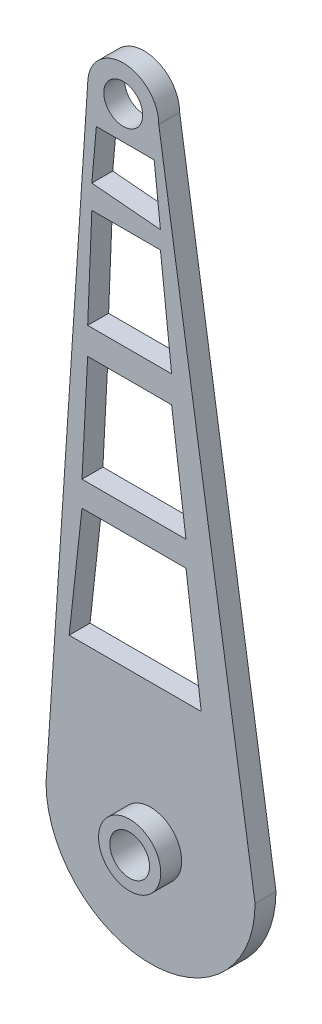
ISO-10303-21;
HEADER;
FILE_DESCRIPTION(('STEP AP214'),'2;1');
FILE_NAME('part.step','',(''),(''),'','','');
FILE_SCHEMA(('AUTOMOTIVE_DESIGN { 1 0 10303 214 1 1 1 1 }'));
ENDSEC;
DATA;
#1=APPLICATION_CONTEXT('core data for automotive mechanical design processes');
#2=APPLICATION_PROTOCOL_DEFINITION('international standard','automotive_design',2000,#1);
#3=PRODUCT_CONTEXT('',#1,'mechanical');
#4=PRODUCT('Part','Part','',(#3));
#5=PRODUCT_RELATED_PRODUCT_CATEGORY('part','',(#4));
#6=PRODUCT_DEFINITION_FORMATION('','',#4);
#7=PRODUCT_DEFINITION_CONTEXT('part definition',#1,'design');
#8=PRODUCT_DEFINITION('design','',#6,#7);
#9=PRODUCT_DEFINITION_SHAPE('','',#8);
#10=(LENGTH_UNIT() NAMED_UNIT(*) SI_UNIT(.MILLI.,.METRE.));
#11=(NAMED_UNIT(*) PLANE_ANGLE_UNIT() SI_UNIT($,.RADIAN.));
#12=(NAMED_UNIT(*) SI_UNIT($,.STERADIAN.) SOLID_ANGLE_UNIT());
#13=UNCERTAINTY_MEASURE_WITH_UNIT(LENGTH_MEASURE(1.E-05),#10,'distance_accuracy_value','');
#14=(GEOMETRIC_REPRESENTATION_CONTEXT(3) GLOBAL_UNCERTAINTY_ASSIGNED_CONTEXT((#13)) GLOBAL_UNIT_ASSIGNED_CONTEXT((#10,
#11,#12)) REPRESENTATION_CONTEXT('',''));
#15=CARTESIAN_POINT('',(0.,0.,0.));
#16=DIRECTION('',(0.,0.,1.));
#17=DIRECTION('',(1.,0.,0.));
#18=AXIS2_PLACEMENT_3D('',#15,#16,#17);
#19=CARTESIAN_POINT('',(-6.5378447721913,149.857454221452,5.));
#20=DIRECTION('',(0.,0.,1.));
#21=DIRECTION('',(1.,0.,0.));
#22=AXIS2_PLACEMENT_3D('',#19,#20,#21);
#23=PLANE('',#22);
#24=CARTESIAN_POINT('',(-6.5378447721913,149.857454221452,5.));
#25=DIRECTION('',(0.,0.,1.));
#26=DIRECTION('',(1.,0.,0.));
#27=AXIS2_PLACEMENT_3D('',#24,#25,#26);
#28=CIRCLE('',#27,4.65778257999736);
#29=CARTESIAN_POINT('',(-1.88006219219394,149.857454221452,5.));
#30=VERTEX_POINT('',#29);
#31=EDGE_CURVE('E548',#30,#30,#28,.T.);
#32=ORIENTED_EDGE('',*,*,#31,.F.);
#33=EDGE_LOOP('',(#32));
#34=FACE_BOUND('',#33,.T.);
#35=DIRECTION('',(-0.087893810296357,-0.996129850025381,0.));
#36=VECTOR('',#35,1.);
#37=CARTESIAN_POINT('',(-12.9624965233202,141.96989307964,5.));
#38=LINE('',#37,#36);
#39=CARTESIAN_POINT('',(-12.9624965233202,141.96989307964,5.));
#40=VERTEX_POINT('',#39);
#41=CARTESIAN_POINT('',(-14.044403658349,129.708278882647,5.));
#42=VERTEX_POINT('',#41);
#43=EDGE_CURVE('E192',#40,#42,#38,.T.);
#44=ORIENTED_EDGE('',*,*,#43,.F.);
#45=DIRECTION('',(-1.,0.,0.));
#46=VECTOR('',#45,1.);
#47=CARTESIAN_POINT('',(0.861872424270282,141.96989307964,5.));
#48=LINE('',#47,#46);
#49=CARTESIAN_POINT('',(0.861872424270282,141.96989307964,5.));
#50=VERTEX_POINT('',#49);
#51=EDGE_CURVE('E183',#50,#40,#48,.T.);
#52=ORIENTED_EDGE('',*,*,#51,.F.);
#53=DIRECTION('',(-0.109170164393305,0.994023075791673,0.));
#54=VECTOR('',#53,1.);
#55=CARTESIAN_POINT('',(2.36756521533757,128.260163982027,5.));
#56=LINE('',#55,#54);
#57=CARTESIAN_POINT('',(2.36756521533757,128.260163982027,5.));
#58=VERTEX_POINT('',#57);
#59=EDGE_CURVE('E210',#58,#50,#56,.T.);
#60=ORIENTED_EDGE('',*,*,#59,.F.);
#61=DIRECTION('',(0.996129850025381,-0.0878938102963577,0.));
#62=VECTOR('',#61,1.);
#63=CARTESIAN_POINT('',(-14.044403658349,129.708278882647,5.));
#64=LINE('',#63,#62);
#65=EDGE_CURVE('E206',#42,#58,#64,.T.);
#66=ORIENTED_EDGE('',*,*,#65,.F.);
#67=EDGE_LOOP('',(#44,#52,#60,#66));
#68=FACE_BOUND('',#67,.T.);
#69=DIRECTION('',(-0.109170164393305,0.994023075791673,0.));
#70=VECTOR('',#69,1.);
#71=CARTESIAN_POINT('',(2.36756521533757,124.058319399719,5.));
#72=LINE('',#71,#70);
#73=CARTESIAN_POINT('',(5.03917599364274,99.732600207782,5.));
#74=VERTEX_POINT('',#73);
#75=CARTESIAN_POINT('',(2.36756521533757,124.058319399719,5.));
#76=VERTEX_POINT('',#75);
#77=EDGE_CURVE('E237',#74,#76,#72,.T.);
#78=ORIENTED_EDGE('',*,*,#77,.F.);
#79=DIRECTION('',(1.,0.,0.));
#80=VECTOR('',#79,1.);
#81=CARTESIAN_POINT('',(5.03917599364274,99.732600207782,5.));
#82=LINE('',#81,#80);
#83=CARTESIAN_POINT('',(-15.0378447721913,99.732600207782,5.));
#84=VERTEX_POINT('',#83);
#85=EDGE_CURVE('E234',#84,#74,#82,.T.);
#86=ORIENTED_EDGE('',*,*,#85,.F.);
#87=DIRECTION('',(-0.0408051122071089,-0.99916712456814,0.));
#88=VECTOR('',#87,1.);
#89=CARTESIAN_POINT('',(-15.0378447721913,99.732600207782,5.));
#90=LINE('',#89,#88);
#91=CARTESIAN_POINT('',(-14.044403658349,124.058319399719,5.));
#92=VERTEX_POINT('',#91);
#93=EDGE_CURVE('E245',#92,#84,#90,.T.);
#94=ORIENTED_EDGE('',*,*,#93,.F.);
#95=DIRECTION('',(-1.,0.,0.));
#96=VECTOR('',#95,1.);
#97=CARTESIAN_POINT('',(-14.044403658349,124.058319399719,5.));
#98=LINE('',#97,#96);
#99=EDGE_CURVE('E241',#76,#92,#98,.T.);
#100=ORIENTED_EDGE('',*,*,#99,.F.);
#101=EDGE_LOOP('',(#78,#86,#94,#100));
#102=FACE_BOUND('',#101,.T.);
#103=DIRECTION('',(-0.130132219195805,0.991496649276827,0.));
#104=VECTOR('',#103,1.);
#105=CARTESIAN_POINT('',(5.03917599364273,93.3110137181854,5.));
#106=LINE('',#105,#104);
#107=CARTESIAN_POINT('',(8.46794809982143,67.1866912758335,5.));
#108=VERTEX_POINT('',#107);
#109=CARTESIAN_POINT('',(5.03917599364273,93.3110137181854,5.));
#110=VERTEX_POINT('',#109);
#111=EDGE_CURVE('E280',#108,#110,#106,.T.);
#112=ORIENTED_EDGE('',*,*,#111,.F.);
#113=DIRECTION('',(1.,0.,0.));
#114=VECTOR('',#113,1.);
#115=CARTESIAN_POINT('',(8.46794809982143,67.1866912758335,5.));
#116=LINE('',#115,#114);
#117=CARTESIAN_POINT('',(-16.3990540110803,67.1866912758335,5.));
#118=VERTEX_POINT('',#117);
#119=EDGE_CURVE('E277',#118,#108,#116,.T.);
#120=ORIENTED_EDGE('',*,*,#119,.F.);
#121=DIRECTION('',(-0.0520344670159903,-0.998645289500913,0.));
#122=VECTOR('',#121,1.);
#123=CARTESIAN_POINT('',(-16.3990540110803,67.1866912758335,5.));
#124=LINE('',#123,#122);
#125=CARTESIAN_POINT('',(-15.0378447721913,93.3110137181854,5.));
#126=VERTEX_POINT('',#125);
#127=EDGE_CURVE('E288',#126,#118,#124,.T.);
#128=ORIENTED_EDGE('',*,*,#127,.F.);
#129=DIRECTION('',(-1.,0.,0.));
#130=VECTOR('',#129,1.);
#131=CARTESIAN_POINT('',(-15.0378447721913,93.3110137181854,5.));
#132=LINE('',#131,#130);
#133=EDGE_CURVE('E284',#110,#126,#132,.T.);
#134=ORIENTED_EDGE('',*,*,#133,.F.);
#135=EDGE_LOOP('',(#112,#120,#128,#134));
#136=FACE_BOUND('',#135,.T.);
#137=DIRECTION('',(-0.130132219195805,0.991496649276827,0.));
#138=VECTOR('',#137,1.);
#139=CARTESIAN_POINT('',(8.46794809982143,61.1794941366831,5.));
#140=LINE('',#139,#138);
#141=CARTESIAN_POINT('',(12.1235655612863,33.3268033389758,5.));
#142=VERTEX_POINT('',#141);
#143=CARTESIAN_POINT('',(8.46794809982143,61.1794941366831,5.));
#144=VERTEX_POINT('',#143);
#145=EDGE_CURVE('E323',#142,#144,#140,.T.);
#146=ORIENTED_EDGE('',*,*,#145,.F.);
#147=DIRECTION('',(1.,0.,0.));
#148=VECTOR('',#147,1.);
#149=CARTESIAN_POINT('',(12.1235655612863,33.3268033389758,5.));
#150=LINE('',#149,#148);
#151=CARTESIAN_POINT('',(-19.4725037101806,33.3268033389758,5.));
#152=VERTEX_POINT('',#151);
#153=EDGE_CURVE('E320',#152,#142,#150,.T.);
#154=ORIENTED_EDGE('',*,*,#153,.F.);
#155=DIRECTION('',(-0.109680861829624,-0.993966854853979,0.));
#156=VECTOR('',#155,1.);
#157=CARTESIAN_POINT('',(-19.4725037101806,33.3268033389758,5.));
#158=LINE('',#157,#156);
#159=CARTESIAN_POINT('',(-16.3990540110803,61.1794941366831,5.));
#160=VERTEX_POINT('',#159);
#161=EDGE_CURVE('E331',#160,#152,#158,.T.);
#162=ORIENTED_EDGE('',*,*,#161,.F.);
#163=DIRECTION('',(-1.,0.,0.));
#164=VECTOR('',#163,1.);
#165=CARTESIAN_POINT('',(-16.3990540110803,61.1794941366831,5.));
#166=LINE('',#165,#164);
#167=EDGE_CURVE('E327',#144,#160,#166,.T.);
#168=ORIENTED_EDGE('',*,*,#167,.F.);
#169=EDGE_LOOP('',(#146,#154,#162,#168));
#170=FACE_BOUND('',#169,.T.);
#171=CARTESIAN_POINT('',(-6.5378447721913,149.857454221452,5.));
#172=DIRECTION('',(0.,0.,1.));
#173=DIRECTION('',(1.,0.,0.));
#174=AXIS2_PLACEMENT_3D('',#171,#172,#173);
#175=CIRCLE('',#174,8.50000000000001);
#176=CARTESIAN_POINT('',(1.96215522780872,149.857454221452,5.));
#177=VERTEX_POINT('',#176);
#178=CARTESIAN_POINT('',(-15.0378447721913,149.857454221452,5.));
#179=VERTEX_POINT('',#178);
#180=EDGE_CURVE('E363',#177,#179,#175,.T.);
#181=ORIENTED_EDGE('',*,*,#180,.T.);
#182=DIRECTION('',(-0.0663311363234438,-0.997797665037377,0.));
#183=VECTOR('',#182,1.);
#184=CARTESIAN_POINT('',(-15.0378447721913,149.857454221452,5.));
#185=LINE('',#184,#183);
#186=CARTESIAN_POINT('',(-25.,0.,5.));
#187=VERTEX_POINT('',#186);
#188=EDGE_CURVE('E367',#179,#187,#185,.T.);
#189=ORIENTED_EDGE('',*,*,#188,.T.);
#190=CARTESIAN_POINT('',(0.,0.,5.));
#191=DIRECTION('',(0.,0.,1.));
#192=DIRECTION('',(1.,0.,0.));
#193=AXIS2_PLACEMENT_3D('',#190,#191,#192);
#194=CIRCLE('',#193,25.);
#195=CARTESIAN_POINT('',(25.,0.,5.));
#196=VERTEX_POINT('',#195);
#197=EDGE_CURVE('E371',#187,#196,#194,.T.);
#198=ORIENTED_EDGE('',*,*,#197,.T.);
#199=DIRECTION('',(-0.151946697068276,0.988388689357604,0.));
#200=VECTOR('',#199,1.);
#201=CARTESIAN_POINT('',(1.96215522780872,149.857454221452,5.));
#202=LINE('',#201,#200);
#203=EDGE_CURVE('E374',#196,#177,#202,.T.);
#204=ORIENTED_EDGE('',*,*,#203,.T.);
#205=EDGE_LOOP('',(#181,#189,#198,#204));
#206=FACE_BOUND('',#205,.T.);
#207=CARTESIAN_POINT('',(0.,0.,5.));
#208=DIRECTION('',(0.,0.,1.));
#209=DIRECTION('',(1.,0.,0.));
#210=AXIS2_PLACEMENT_3D('',#207,#208,#209);
#211=CIRCLE('',#210,7.44384103695523);
#212=CARTESIAN_POINT('',(7.44384103695523,0.,5.));
#213=VERTEX_POINT('',#212);
#214=EDGE_CURVE('E539',#213,#213,#211,.T.);
#215=ORIENTED_EDGE('',*,*,#214,.F.);
#216=EDGE_LOOP('',(#215));
#217=FACE_BOUND('',#216,.T.);
#218=ADVANCED_FACE('F45',(#34,#68,#102,#136,#170,#206,#217),#23,.T.);
#219=CARTESIAN_POINT('',(-6.5378447721913,149.857454221452,0.));
#220=DIRECTION('',(0.,0.,1.));
#221=DIRECTION('',(1.,0.,0.));
#222=AXIS2_PLACEMENT_3D('',#219,#220,#221);
#223=PLANE('',#222);
#224=DIRECTION('',(1.,0.,0.));
#225=VECTOR('',#224,1.);
#226=CARTESIAN_POINT('',(5.03917599364274,99.732600207782,0.));
#227=LINE('',#226,#225);
#228=CARTESIAN_POINT('',(-15.0378447721913,99.732600207782,0.));
#229=VERTEX_POINT('',#228);
#230=CARTESIAN_POINT('',(5.03917599364274,99.732600207782,0.));
#231=VERTEX_POINT('',#230);
#232=EDGE_CURVE('E201',#229,#231,#227,.T.);
#233=ORIENTED_EDGE('',*,*,#232,.T.);
#234=DIRECTION('',(-0.109170164393305,0.994023075791673,0.));
#235=VECTOR('',#234,1.);
#236=CARTESIAN_POINT('',(2.36756521533757,124.058319399719,0.));
#237=LINE('',#236,#235);
#238=CARTESIAN_POINT('',(2.36756521533757,124.058319399719,0.));
#239=VERTEX_POINT('',#238);
#240=EDGE_CURVE('E252',#231,#239,#237,.T.);
#241=ORIENTED_EDGE('',*,*,#240,.T.);
#242=DIRECTION('',(-1.,0.,0.));
#243=VECTOR('',#242,1.);
#244=CARTESIAN_POINT('',(-14.044403658349,124.058319399719,0.));
#245=LINE('',#244,#243);
#246=CARTESIAN_POINT('',(-14.044403658349,124.058319399719,0.));
#247=VERTEX_POINT('',#246);
#248=EDGE_CURVE('E256',#239,#247,#245,.T.);
#249=ORIENTED_EDGE('',*,*,#248,.T.);
#250=DIRECTION('',(-0.0408051122071089,-0.99916712456814,0.));
#251=VECTOR('',#250,1.);
#252=CARTESIAN_POINT('',(-15.0378447721913,99.732600207782,0.));
#253=LINE('',#252,#251);
#254=EDGE_CURVE('E238',#247,#229,#253,.T.);
#255=ORIENTED_EDGE('',*,*,#254,.T.);
#256=EDGE_LOOP('',(#233,#241,#249,#255));
#257=FACE_BOUND('',#256,.T.);
#258=DIRECTION('',(1.,0.,0.));
#259=VECTOR('',#258,1.);
#260=CARTESIAN_POINT('',(12.1235655612863,33.3268033389758,0.));
#261=LINE('',#260,#259);
#262=CARTESIAN_POINT('',(-19.4725037101806,33.3268033389758,0.));
#263=VERTEX_POINT('',#262);
#264=CARTESIAN_POINT('',(12.1235655612863,33.3268033389758,0.));
#265=VERTEX_POINT('',#264);
#266=EDGE_CURVE('E319',#263,#265,#261,.T.);
#267=ORIENTED_EDGE('',*,*,#266,.T.);
#268=DIRECTION('',(-0.130132219195805,0.991496649276827,0.));
#269=VECTOR('',#268,1.);
#270=CARTESIAN_POINT('',(8.46794809982143,61.1794941366831,0.));
#271=LINE('',#270,#269);
#272=CARTESIAN_POINT('',(8.46794809982143,61.1794941366831,0.));
#273=VERTEX_POINT('',#272);
#274=EDGE_CURVE('E338',#265,#273,#271,.T.);
#275=ORIENTED_EDGE('',*,*,#274,.T.);
#276=DIRECTION('',(-1.,0.,0.));
#277=VECTOR('',#276,1.);
#278=CARTESIAN_POINT('',(-16.3990540110803,61.1794941366831,0.));
#279=LINE('',#278,#277);
#280=CARTESIAN_POINT('',(-16.3990540110803,61.1794941366831,0.));
#281=VERTEX_POINT('',#280);
#282=EDGE_CURVE('E342',#273,#281,#279,.T.);
#283=ORIENTED_EDGE('',*,*,#282,.T.);
#284=DIRECTION('',(-0.109680861829624,-0.993966854853979,0.));
#285=VECTOR('',#284,1.);
#286=CARTESIAN_POINT('',(-19.4725037101806,33.3268033389758,0.));
#287=LINE('',#286,#285);
#288=EDGE_CURVE('E324',#281,#263,#287,.T.);
#289=ORIENTED_EDGE('',*,*,#288,.T.);
#290=EDGE_LOOP('',(#267,#275,#283,#289));
#291=FACE_BOUND('',#290,.T.);
#292=CARTESIAN_POINT('',(-6.5378447721913,149.857454221452,0.));
#293=DIRECTION('',(0.,0.,1.));
#294=DIRECTION('',(1.,0.,0.));
#295=AXIS2_PLACEMENT_3D('',#292,#293,#294);
#296=CIRCLE('',#295,8.50000000000001);
#297=CARTESIAN_POINT('',(1.96215522780872,149.857454221452,0.));
#298=VERTEX_POINT('',#297);
#299=CARTESIAN_POINT('',(-15.0378447721913,149.857454221452,0.));
#300=VERTEX_POINT('',#299);
#301=EDGE_CURVE('E362',#298,#300,#296,.T.);
#302=ORIENTED_EDGE('',*,*,#301,.F.);
#303=DIRECTION('',(-0.151946697068276,0.988388689357604,0.));
#304=VECTOR('',#303,1.);
#305=CARTESIAN_POINT('',(1.96215522780872,149.857454221452,0.));
#306=LINE('',#305,#304);
#307=CARTESIAN_POINT('',(25.,0.,0.));
#308=VERTEX_POINT('',#307);
#309=EDGE_CURVE('E368',#308,#298,#306,.T.);
#310=ORIENTED_EDGE('',*,*,#309,.F.);
#311=CARTESIAN_POINT('',(0.,0.,0.));
#312=DIRECTION('',(0.,0.,1.));
#313=DIRECTION('',(1.,0.,0.));
#314=AXIS2_PLACEMENT_3D('',#311,#312,#313);
#315=CIRCLE('',#314,25.);
#316=CARTESIAN_POINT('',(-25.,0.,0.));
#317=VERTEX_POINT('',#316);
#318=EDGE_CURVE('E384',#317,#308,#315,.T.);
#319=ORIENTED_EDGE('',*,*,#318,.F.);
#320=DIRECTION('',(-0.0663311363234438,-0.997797665037377,0.));
#321=VECTOR('',#320,1.);
#322=CARTESIAN_POINT('',(-15.0378447721913,149.857454221452,0.));
#323=LINE('',#322,#321);
#324=EDGE_CURVE('E381',#300,#317,#323,.T.);
#325=ORIENTED_EDGE('',*,*,#324,.F.);
#326=EDGE_LOOP('',(#302,#310,#319,#325));
#327=FACE_BOUND('',#326,.T.);
#328=DIRECTION('',(1.,0.,0.));
#329=VECTOR('',#328,1.);
#330=CARTESIAN_POINT('',(8.46794809982143,67.1866912758335,0.));
#331=LINE('',#330,#329);
#332=CARTESIAN_POINT('',(-16.3990540110803,67.1866912758335,0.));
#333=VERTEX_POINT('',#332);
#334=CARTESIAN_POINT('',(8.46794809982143,67.1866912758335,0.));
#335=VERTEX_POINT('',#334);
#336=EDGE_CURVE('E276',#333,#335,#331,.T.);
#337=ORIENTED_EDGE('',*,*,#336,.T.);
#338=DIRECTION('',(-0.130132219195805,0.991496649276827,0.));
#339=VECTOR('',#338,1.);
#340=CARTESIAN_POINT('',(5.03917599364273,93.3110137181854,0.));
#341=LINE('',#340,#339);
#342=CARTESIAN_POINT('',(5.03917599364273,93.3110137181854,0.));
#343=VERTEX_POINT('',#342);
#344=EDGE_CURVE('E295',#335,#343,#341,.T.);
#345=ORIENTED_EDGE('',*,*,#344,.T.);
#346=DIRECTION('',(-1.,0.,0.));
#347=VECTOR('',#346,1.);
#348=CARTESIAN_POINT('',(-15.0378447721913,93.3110137181854,0.));
#349=LINE('',#348,#347);
#350=CARTESIAN_POINT('',(-15.0378447721913,93.3110137181854,0.));
#351=VERTEX_POINT('',#350);
#352=EDGE_CURVE('E299',#343,#351,#349,.T.);
#353=ORIENTED_EDGE('',*,*,#352,.T.);
#354=DIRECTION('',(-0.0520344670159903,-0.998645289500913,0.));
#355=VECTOR('',#354,1.);
#356=CARTESIAN_POINT('',(-16.3990540110803,67.1866912758335,0.));
#357=LINE('',#356,#355);
#358=EDGE_CURVE('E281',#351,#333,#357,.T.);
#359=ORIENTED_EDGE('',*,*,#358,.T.);
#360=EDGE_LOOP('',(#337,#345,#353,#359));
#361=FACE_BOUND('',#360,.T.);
#362=DIRECTION('',(-1.,0.,0.));
#363=VECTOR('',#362,1.);
#364=CARTESIAN_POINT('',(0.861872424270282,141.96989307964,0.));
#365=LINE('',#364,#363);
#366=CARTESIAN_POINT('',(0.861872424270282,141.96989307964,0.));
#367=VERTEX_POINT('',#366);
#368=CARTESIAN_POINT('',(-12.9624965233202,141.96989307964,0.));
#369=VERTEX_POINT('',#368);
#370=EDGE_CURVE('E69',#367,#369,#365,.T.);
#371=ORIENTED_EDGE('',*,*,#370,.T.);
#372=DIRECTION('',(-0.087893810296357,-0.996129850025381,0.));
#373=VECTOR('',#372,1.);
#374=CARTESIAN_POINT('',(-12.9624965233202,141.96989307964,0.));
#375=LINE('',#374,#373);
#376=CARTESIAN_POINT('',(-14.044403658349,129.708278882647,0.));
#377=VERTEX_POINT('',#376);
#378=EDGE_CURVE('E199',#369,#377,#375,.T.);
#379=ORIENTED_EDGE('',*,*,#378,.T.);
#380=DIRECTION('',(0.996129850025381,-0.0878938102963577,0.));
#381=VECTOR('',#380,1.);
#382=CARTESIAN_POINT('',(-14.044403658349,129.708278882647,0.));
#383=LINE('',#382,#381);
#384=CARTESIAN_POINT('',(2.36756521533757,128.260163982027,0.));
#385=VERTEX_POINT('',#384);
#386=EDGE_CURVE('E221',#377,#385,#383,.T.);
#387=ORIENTED_EDGE('',*,*,#386,.T.);
#388=DIRECTION('',(-0.109170164393305,0.994023075791673,0.));
#389=VECTOR('',#388,1.);
#390=CARTESIAN_POINT('',(2.36756521533757,128.260163982027,0.));
#391=LINE('',#390,#389);
#392=EDGE_CURVE('E193',#385,#367,#391,.T.);
#393=ORIENTED_EDGE('',*,*,#392,.T.);
#394=EDGE_LOOP('',(#371,#379,#387,#393));
#395=FACE_BOUND('',#394,.T.);
#396=CARTESIAN_POINT('',(0.,0.,0.));
#397=DIRECTION('',(0.,0.,1.));
#398=DIRECTION('',(1.,0.,0.));
#399=AXIS2_PLACEMENT_3D('',#396,#397,#398);
#400=CIRCLE('',#399,4.76663253764909);
#401=CARTESIAN_POINT('',(4.76663253764909,0.,0.));
#402=VERTEX_POINT('',#401);
#403=EDGE_CURVE('E218',#402,#402,#400,.T.);
#404=ORIENTED_EDGE('',*,*,#403,.T.);
#405=EDGE_LOOP('',(#404));
#406=FACE_BOUND('',#405,.T.);
#407=CARTESIAN_POINT('',(-6.5378447721913,149.857454221452,0.));
#408=DIRECTION('',(0.,0.,1.));
#409=DIRECTION('',(1.,0.,0.));
#410=AXIS2_PLACEMENT_3D('',#407,#408,#409);
#411=CIRCLE('',#410,4.65778257999736);
#412=CARTESIAN_POINT('',(-1.88006219219394,149.857454221452,0.));
#413=VERTEX_POINT('',#412);
#414=EDGE_CURVE('E546',#413,#413,#411,.T.);
#415=ORIENTED_EDGE('',*,*,#414,.T.);
#416=EDGE_LOOP('',(#415));
#417=FACE_BOUND('',#416,.T.);
#418=ADVANCED_FACE('F407',(#257,#291,#327,#361,#395,#406,#417),#223,.F.);
#419=CARTESIAN_POINT('',(-6.5378447721913,149.857454221452,5.));
#420=DIRECTION('',(0.,0.,-1.));
#421=DIRECTION('',(-1.,0.,0.));
#422=AXIS2_PLACEMENT_3D('',#419,#420,#421);
#423=CYLINDRICAL_SURFACE('',#422,8.50000000000001);
#424=ORIENTED_EDGE('',*,*,#301,.T.);
#425=DIRECTION('',(0.,0.,-1.));
#426=VECTOR('',#425,1.);
#427=CARTESIAN_POINT('',(-15.0378447721913,149.857454221452,5.));
#428=LINE('',#427,#426);
#429=EDGE_CURVE('E11',#179,#300,#428,.T.);
#430=ORIENTED_EDGE('',*,*,#429,.F.);
#431=ORIENTED_EDGE('',*,*,#180,.F.);
#432=DIRECTION('',(0.,0.,-1.));
#433=VECTOR('',#432,1.);
#434=CARTESIAN_POINT('',(1.96215522780872,149.857454221452,5.));
#435=LINE('',#434,#433);
#436=EDGE_CURVE('E377',#177,#298,#435,.T.);
#437=ORIENTED_EDGE('',*,*,#436,.T.);
#438=EDGE_LOOP('',(#424,#430,#431,#437));
#439=FACE_BOUND('',#438,.T.);
#440=ADVANCED_FACE('F47',(#439),#423,.T.);
#441=CARTESIAN_POINT('',(-15.0378447721913,149.857454221452,5.));
#442=DIRECTION('',(0.997797665037377,-0.0663311363234438,0.));
#443=DIRECTION('',(0.0663311363234438,0.997797665037377,0.));
#444=AXIS2_PLACEMENT_3D('',#441,#442,#443);
#445=PLANE('',#444);
#446=ORIENTED_EDGE('',*,*,#324,.T.);
#447=DIRECTION('',(0.,0.,-1.));
#448=VECTOR('',#447,1.);
#449=CARTESIAN_POINT('',(-25.,0.,5.));
#450=LINE('',#449,#448);
#451=EDGE_CURVE('E54',#187,#317,#450,.T.);
#452=ORIENTED_EDGE('',*,*,#451,.F.);
#453=ORIENTED_EDGE('',*,*,#188,.F.);
#454=ORIENTED_EDGE('',*,*,#429,.T.);
#455=EDGE_LOOP('',(#446,#452,#453,#454));
#456=FACE_BOUND('',#455,.T.);
#457=ADVANCED_FACE('F418',(#456),#445,.F.);
#458=CARTESIAN_POINT('',(0.,0.,5.));
#459=DIRECTION('',(0.,0.,-1.));
#460=DIRECTION('',(-1.,0.,0.));
#461=AXIS2_PLACEMENT_3D('',#458,#459,#460);
#462=CYLINDRICAL_SURFACE('',#461,25.);
#463=ORIENTED_EDGE('',*,*,#318,.T.);
#464=DIRECTION('',(0.,0.,-1.));
#465=VECTOR('',#464,1.);
#466=CARTESIAN_POINT('',(25.,0.,5.));
#467=LINE('',#466,#465);
#468=EDGE_CURVE('E392',#196,#308,#467,.T.);
#469=ORIENTED_EDGE('',*,*,#468,.F.);
#470=ORIENTED_EDGE('',*,*,#197,.F.);
#471=ORIENTED_EDGE('',*,*,#451,.T.);
#472=EDGE_LOOP('',(#463,#469,#470,#471));
#473=FACE_BOUND('',#472,.T.);
#474=ADVANCED_FACE('F401',(#473),#462,.T.);
#475=CARTESIAN_POINT('',(1.96215522780872,149.857454221452,5.));
#476=DIRECTION('',(-0.988388689357604,-0.151946697068276,0.));
#477=DIRECTION('',(0.151946697068276,-0.988388689357604,0.));
#478=AXIS2_PLACEMENT_3D('',#475,#476,#477);
#479=PLANE('',#478);
#480=ORIENTED_EDGE('',*,*,#309,.T.);
#481=ORIENTED_EDGE('',*,*,#436,.F.);
#482=ORIENTED_EDGE('',*,*,#203,.F.);
#483=ORIENTED_EDGE('',*,*,#468,.T.);
#484=EDGE_LOOP('',(#480,#481,#482,#483));
#485=FACE_BOUND('',#484,.T.);
#486=ADVANCED_FACE('F411',(#485),#479,.F.);
#487=CARTESIAN_POINT('',(12.1235655612863,33.3268033389758,5.));
#488=DIRECTION('',(0.,1.,0.));
#489=DIRECTION('',(0.,0.,1.));
#490=AXIS2_PLACEMENT_3D('',#487,#488,#489);
#491=PLANE('',#490);
#492=ORIENTED_EDGE('',*,*,#266,.F.);
#493=DIRECTION('',(0.,0.,-1.));
#494=VECTOR('',#493,1.);
#495=CARTESIAN_POINT('',(-19.4725037101806,33.3268033389758,5.));
#496=LINE('',#495,#494);
#497=EDGE_CURVE('E334',#152,#263,#496,.T.);
#498=ORIENTED_EDGE('',*,*,#497,.F.);
#499=ORIENTED_EDGE('',*,*,#153,.T.);
#500=DIRECTION('',(0.,0.,-1.));
#501=VECTOR('',#500,1.);
#502=CARTESIAN_POINT('',(12.1235655612863,33.3268033389758,5.));
#503=LINE('',#502,#501);
#504=EDGE_CURVE('E358',#142,#265,#503,.T.);
#505=ORIENTED_EDGE('',*,*,#504,.T.);
#506=EDGE_LOOP('',(#492,#498,#499,#505));
#507=FACE_BOUND('',#506,.T.);
#508=ADVANCED_FACE('F437',(#507),#491,.T.);
#509=CARTESIAN_POINT('',(8.46794809982143,61.1794941366831,5.));
#510=DIRECTION('',(-0.991496649276827,-0.130132219195805,0.));
#511=DIRECTION('',(0.130132219195805,-0.991496649276827,0.));
#512=AXIS2_PLACEMENT_3D('',#509,#510,#511);
#513=PLANE('',#512);
#514=ORIENTED_EDGE('',*,*,#274,.F.);
#515=ORIENTED_EDGE('',*,*,#504,.F.);
#516=ORIENTED_EDGE('',*,*,#145,.T.);
#517=DIRECTION('',(0.,0.,-1.));
#518=VECTOR('',#517,1.);
#519=CARTESIAN_POINT('',(8.46794809982143,61.1794941366831,5.));
#520=LINE('',#519,#518);
#521=EDGE_CURVE('E355',#144,#273,#520,.T.);
#522=ORIENTED_EDGE('',*,*,#521,.T.);
#523=EDGE_LOOP('',(#514,#515,#516,#522));
#524=FACE_BOUND('',#523,.T.);
#525=ADVANCED_FACE('F444',(#524),#513,.T.);
#526=CARTESIAN_POINT('',(-16.3990540110803,61.1794941366831,5.));
#527=DIRECTION('',(0.,-1.,0.));
#528=DIRECTION('',(0.,0.,-1.));
#529=AXIS2_PLACEMENT_3D('',#526,#527,#528);
#530=PLANE('',#529);
#531=ORIENTED_EDGE('',*,*,#282,.F.);
#532=ORIENTED_EDGE('',*,*,#521,.F.);
#533=ORIENTED_EDGE('',*,*,#167,.T.);
#534=DIRECTION('',(0.,0.,-1.));
#535=VECTOR('',#534,1.);
#536=CARTESIAN_POINT('',(-16.3990540110803,61.1794941366831,5.));
#537=LINE('',#536,#535);
#538=EDGE_CURVE('E352',#160,#281,#537,.T.);
#539=ORIENTED_EDGE('',*,*,#538,.T.);
#540=EDGE_LOOP('',(#531,#532,#533,#539));
#541=FACE_BOUND('',#540,.T.);
#542=ADVANCED_FACE('F449',(#541),#530,.T.);
#543=CARTESIAN_POINT('',(-19.4725037101806,33.3268033389758,5.));
#544=DIRECTION('',(0.993966854853979,-0.109680861829624,0.));
#545=DIRECTION('',(0.109680861829624,0.993966854853979,0.));
#546=AXIS2_PLACEMENT_3D('',#543,#544,#545);
#547=PLANE('',#546);
#548=ORIENTED_EDGE('',*,*,#288,.F.);
#549=ORIENTED_EDGE('',*,*,#538,.F.);
#550=ORIENTED_EDGE('',*,*,#161,.T.);
#551=ORIENTED_EDGE('',*,*,#497,.T.);
#552=EDGE_LOOP('',(#548,#549,#550,#551));
#553=FACE_BOUND('',#552,.T.);
#554=ADVANCED_FACE('F457',(#553),#547,.T.);
#555=CARTESIAN_POINT('',(8.46794809982143,67.1866912758335,5.));
#556=DIRECTION('',(0.,1.,0.));
#557=DIRECTION('',(0.,0.,1.));
#558=AXIS2_PLACEMENT_3D('',#555,#556,#557);
#559=PLANE('',#558);
#560=ORIENTED_EDGE('',*,*,#336,.F.);
#561=DIRECTION('',(0.,0.,-1.));
#562=VECTOR('',#561,1.);
#563=CARTESIAN_POINT('',(-16.3990540110803,67.1866912758335,5.));
#564=LINE('',#563,#562);
#565=EDGE_CURVE('E291',#118,#333,#564,.T.);
#566=ORIENTED_EDGE('',*,*,#565,.F.);
#567=ORIENTED_EDGE('',*,*,#119,.T.);
#568=DIRECTION('',(0.,0.,-1.));
#569=VECTOR('',#568,1.);
#570=CARTESIAN_POINT('',(8.46794809982143,67.1866912758335,5.));
#571=LINE('',#570,#569);
#572=EDGE_CURVE('E315',#108,#335,#571,.T.);
#573=ORIENTED_EDGE('',*,*,#572,.T.);
#574=EDGE_LOOP('',(#560,#566,#567,#573));
#575=FACE_BOUND('',#574,.T.);
#576=ADVANCED_FACE('F470',(#575),#559,.T.);
#577=CARTESIAN_POINT('',(5.03917599364273,93.3110137181854,5.));
#578=DIRECTION('',(-0.991496649276827,-0.130132219195805,0.));
#579=DIRECTION('',(0.130132219195805,-0.991496649276827,0.));
#580=AXIS2_PLACEMENT_3D('',#577,#578,#579);
#581=PLANE('',#580);
#582=ORIENTED_EDGE('',*,*,#344,.F.);
#583=ORIENTED_EDGE('',*,*,#572,.F.);
#584=ORIENTED_EDGE('',*,*,#111,.T.);
#585=DIRECTION('',(0.,0.,-1.));
#586=VECTOR('',#585,1.);
#587=CARTESIAN_POINT('',(5.03917599364273,93.3110137181854,5.));
#588=LINE('',#587,#586);
#589=EDGE_CURVE('E312',#110,#343,#588,.T.);
#590=ORIENTED_EDGE('',*,*,#589,.T.);
#591=EDGE_LOOP('',(#582,#583,#584,#590));
#592=FACE_BOUND('',#591,.T.);
#593=ADVANCED_FACE('F475',(#592),#581,.T.);
#594=CARTESIAN_POINT('',(-15.0378447721913,93.3110137181854,5.));
#595=DIRECTION('',(0.,-1.,0.));
#596=DIRECTION('',(0.,0.,-1.));
#597=AXIS2_PLACEMENT_3D('',#594,#595,#596);
#598=PLANE('',#597);
#599=ORIENTED_EDGE('',*,*,#352,.F.);
#600=ORIENTED_EDGE('',*,*,#589,.F.);
#601=ORIENTED_EDGE('',*,*,#133,.T.);
#602=DIRECTION('',(0.,0.,-1.));
#603=VECTOR('',#602,1.);
#604=CARTESIAN_POINT('',(-15.0378447721913,93.3110137181854,5.));
#605=LINE('',#604,#603);
#606=EDGE_CURVE('E309',#126,#351,#605,.T.);
#607=ORIENTED_EDGE('',*,*,#606,.T.);
#608=EDGE_LOOP('',(#599,#600,#601,#607));
#609=FACE_BOUND('',#608,.T.);
#610=ADVANCED_FACE('F479',(#609),#598,.T.);
#611=CARTESIAN_POINT('',(-16.3990540110803,67.1866912758335,5.));
#612=DIRECTION('',(0.998645289500913,-0.0520344670159904,0.));
#613=DIRECTION('',(0.0520344670159904,0.998645289500913,0.));
#614=AXIS2_PLACEMENT_3D('',#611,#612,#613);
#615=PLANE('',#614);
#616=ORIENTED_EDGE('',*,*,#358,.F.);
#617=ORIENTED_EDGE('',*,*,#606,.F.);
#618=ORIENTED_EDGE('',*,*,#127,.T.);
#619=ORIENTED_EDGE('',*,*,#565,.T.);
#620=EDGE_LOOP('',(#616,#617,#618,#619));
#621=FACE_BOUND('',#620,.T.);
#622=ADVANCED_FACE('F483',(#621),#615,.T.);
#623=CARTESIAN_POINT('',(5.03917599364274,99.732600207782,5.));
#624=DIRECTION('',(0.,1.,0.));
#625=DIRECTION('',(0.,0.,1.));
#626=AXIS2_PLACEMENT_3D('',#623,#624,#625);
#627=PLANE('',#626);
#628=ORIENTED_EDGE('',*,*,#232,.F.);
#629=DIRECTION('',(0.,0.,-1.));
#630=VECTOR('',#629,1.);
#631=CARTESIAN_POINT('',(-15.0378447721913,99.732600207782,5.));
#632=LINE('',#631,#630);
#633=EDGE_CURVE('E248',#84,#229,#632,.T.);
#634=ORIENTED_EDGE('',*,*,#633,.F.);
#635=ORIENTED_EDGE('',*,*,#85,.T.);
#636=DIRECTION('',(0.,0.,-1.));
#637=VECTOR('',#636,1.);
#638=CARTESIAN_POINT('',(5.03917599364274,99.732600207782,5.));
#639=LINE('',#638,#637);
#640=EDGE_CURVE('E272',#74,#231,#639,.T.);
#641=ORIENTED_EDGE('',*,*,#640,.T.);
#642=EDGE_LOOP('',(#628,#634,#635,#641));
#643=FACE_BOUND('',#642,.T.);
#644=ADVANCED_FACE('F487',(#643),#627,.T.);
#645=CARTESIAN_POINT('',(2.36756521533757,124.058319399719,5.));
#646=DIRECTION('',(-0.994023075791673,-0.109170164393305,0.));
#647=DIRECTION('',(0.109170164393305,-0.994023075791673,0.));
#648=AXIS2_PLACEMENT_3D('',#645,#646,#647);
#649=PLANE('',#648);
#650=ORIENTED_EDGE('',*,*,#240,.F.);
#651=ORIENTED_EDGE('',*,*,#640,.F.);
#652=ORIENTED_EDGE('',*,*,#77,.T.);
#653=DIRECTION('',(0.,0.,-1.));
#654=VECTOR('',#653,1.);
#655=CARTESIAN_POINT('',(2.36756521533757,124.058319399719,5.));
#656=LINE('',#655,#654);
#657=EDGE_CURVE('E269',#76,#239,#656,.T.);
#658=ORIENTED_EDGE('',*,*,#657,.T.);
#659=EDGE_LOOP('',(#650,#651,#652,#658));
#660=FACE_BOUND('',#659,.T.);
#661=ADVANCED_FACE('F491',(#660),#649,.T.);
#662=CARTESIAN_POINT('',(-14.044403658349,124.058319399719,5.));
#663=DIRECTION('',(0.,-1.,0.));
#664=DIRECTION('',(0.,0.,-1.));
#665=AXIS2_PLACEMENT_3D('',#662,#663,#664);
#666=PLANE('',#665);
#667=ORIENTED_EDGE('',*,*,#248,.F.);
#668=ORIENTED_EDGE('',*,*,#657,.F.);
#669=ORIENTED_EDGE('',*,*,#99,.T.);
#670=DIRECTION('',(0.,0.,-1.));
#671=VECTOR('',#670,1.);
#672=CARTESIAN_POINT('',(-14.044403658349,124.058319399719,5.));
#673=LINE('',#672,#671);
#674=EDGE_CURVE('E266',#92,#247,#673,.T.);
#675=ORIENTED_EDGE('',*,*,#674,.T.);
#676=EDGE_LOOP('',(#667,#668,#669,#675));
#677=FACE_BOUND('',#676,.T.);
#678=ADVANCED_FACE('F495',(#677),#666,.T.);
#679=CARTESIAN_POINT('',(-15.0378447721913,99.732600207782,5.));
#680=DIRECTION('',(0.99916712456814,-0.0408051122071089,0.));
#681=DIRECTION('',(0.0408051122071089,0.99916712456814,0.));
#682=AXIS2_PLACEMENT_3D('',#679,#680,#681);
#683=PLANE('',#682);
#684=ORIENTED_EDGE('',*,*,#254,.F.);
#685=ORIENTED_EDGE('',*,*,#674,.F.);
#686=ORIENTED_EDGE('',*,*,#93,.T.);
#687=ORIENTED_EDGE('',*,*,#633,.T.);
#688=EDGE_LOOP('',(#684,#685,#686,#687));
#689=FACE_BOUND('',#688,.T.);
#690=ADVANCED_FACE('F499',(#689),#683,.T.);
#691=CARTESIAN_POINT('',(0.861872424270282,141.96989307964,5.));
#692=DIRECTION('',(0.,-1.,0.));
#693=DIRECTION('',(0.,0.,-1.));
#694=AXIS2_PLACEMENT_3D('',#691,#692,#693);
#695=PLANE('',#694);
#696=ORIENTED_EDGE('',*,*,#370,.F.);
#697=DIRECTION('',(0.,0.,-1.));
#698=VECTOR('',#697,1.);
#699=CARTESIAN_POINT('',(0.861872424270282,141.96989307964,5.));
#700=LINE('',#699,#698);
#701=EDGE_CURVE('E187',#50,#367,#700,.T.);
#702=ORIENTED_EDGE('',*,*,#701,.F.);
#703=ORIENTED_EDGE('',*,*,#51,.T.);
#704=DIRECTION('',(0.,0.,-1.));
#705=VECTOR('',#704,1.);
#706=CARTESIAN_POINT('',(-12.9624965233202,141.96989307964,5.));
#707=LINE('',#706,#705);
#708=EDGE_CURVE('E186',#40,#369,#707,.T.);
#709=ORIENTED_EDGE('',*,*,#708,.T.);
#710=EDGE_LOOP('',(#696,#702,#703,#709));
#711=FACE_BOUND('',#710,.T.);
#712=ADVANCED_FACE('F185',(#711),#695,.T.);
#713=CARTESIAN_POINT('',(-12.9624965233202,141.96989307964,5.));
#714=DIRECTION('',(0.996129850025381,-0.087893810296357,0.));
#715=DIRECTION('',(0.087893810296357,0.996129850025381,0.));
#716=AXIS2_PLACEMENT_3D('',#713,#714,#715);
#717=PLANE('',#716);
#718=ORIENTED_EDGE('',*,*,#378,.F.);
#719=ORIENTED_EDGE('',*,*,#708,.F.);
#720=ORIENTED_EDGE('',*,*,#43,.T.);
#721=DIRECTION('',(0.,0.,-1.));
#722=VECTOR('',#721,1.);
#723=CARTESIAN_POINT('',(-14.044403658349,129.708278882647,5.));
#724=LINE('',#723,#722);
#725=EDGE_CURVE('E202',#42,#377,#724,.T.);
#726=ORIENTED_EDGE('',*,*,#725,.T.);
#727=EDGE_LOOP('',(#718,#719,#720,#726));
#728=FACE_BOUND('',#727,.T.);
#729=ADVANCED_FACE('F196',(#728),#717,.T.);
#730=CARTESIAN_POINT('',(-14.044403658349,129.708278882647,5.));
#731=DIRECTION('',(0.0878938102963577,0.996129850025381,0.));
#732=DIRECTION('',(-0.996129850025381,0.0878938102963577,0.));
#733=AXIS2_PLACEMENT_3D('',#730,#731,#732);
#734=PLANE('',#733);
#735=ORIENTED_EDGE('',*,*,#386,.F.);
#736=ORIENTED_EDGE('',*,*,#725,.F.);
#737=ORIENTED_EDGE('',*,*,#65,.T.);
#738=DIRECTION('',(0.,0.,-1.));
#739=VECTOR('',#738,1.);
#740=CARTESIAN_POINT('',(2.36756521533757,128.260163982027,5.));
#741=LINE('',#740,#739);
#742=EDGE_CURVE('E61',#58,#385,#741,.T.);
#743=ORIENTED_EDGE('',*,*,#742,.T.);
#744=EDGE_LOOP('',(#735,#736,#737,#743));
#745=FACE_BOUND('',#744,.T.);
#746=ADVANCED_FACE('F508',(#745),#734,.T.);
#747=CARTESIAN_POINT('',(2.36756521533757,128.260163982027,5.));
#748=DIRECTION('',(-0.994023075791673,-0.109170164393305,0.));
#749=DIRECTION('',(0.109170164393305,-0.994023075791673,0.));
#750=AXIS2_PLACEMENT_3D('',#747,#748,#749);
#751=PLANE('',#750);
#752=ORIENTED_EDGE('',*,*,#392,.F.);
#753=ORIENTED_EDGE('',*,*,#742,.F.);
#754=ORIENTED_EDGE('',*,*,#59,.T.);
#755=ORIENTED_EDGE('',*,*,#701,.T.);
#756=EDGE_LOOP('',(#752,#753,#754,#755));
#757=FACE_BOUND('',#756,.T.);
#758=ADVANCED_FACE('F511',(#757),#751,.T.);
#759=CARTESIAN_POINT('',(0.,0.,5.));
#760=DIRECTION('',(0.,0.,-1.));
#761=DIRECTION('',(-1.,0.,0.));
#762=AXIS2_PLACEMENT_3D('',#759,#760,#761);
#763=CYLINDRICAL_SURFACE('',#762,4.76663253764909);
#764=ORIENTED_EDGE('',*,*,#403,.F.);
#765=EDGE_LOOP('',(#764));
#766=FACE_BOUND('',#765,.T.);
#767=CARTESIAN_POINT('',(0.,0.,10.));
#768=DIRECTION('',(0.,0.,1.));
#769=DIRECTION('',(1.,0.,0.));
#770=AXIS2_PLACEMENT_3D('',#767,#768,#769);
#771=CIRCLE('',#770,4.76663253764909);
#772=CARTESIAN_POINT('',(4.76663253764909,0.,10.));
#773=VERTEX_POINT('',#772);
#774=EDGE_CURVE('E536',#773,#773,#771,.T.);
#775=ORIENTED_EDGE('',*,*,#774,.T.);
#776=EDGE_LOOP('',(#775));
#777=FACE_BOUND('',#776,.T.);
#778=ADVANCED_FACE('F515',(#766,#777),#763,.F.);
#779=CARTESIAN_POINT('',(-6.5378447721913,149.857454221452,5.));
#780=DIRECTION('',(0.,0.,-1.));
#781=DIRECTION('',(-1.,0.,0.));
#782=AXIS2_PLACEMENT_3D('',#779,#780,#781);
#783=CYLINDRICAL_SURFACE('',#782,4.65778257999736);
#784=ORIENTED_EDGE('',*,*,#31,.T.);
#785=EDGE_LOOP('',(#784));
#786=FACE_BOUND('',#785,.T.);
#787=ORIENTED_EDGE('',*,*,#414,.F.);
#788=EDGE_LOOP('',(#787));
#789=FACE_BOUND('',#788,.T.);
#790=ADVANCED_FACE('F517',(#786,#789),#783,.F.);
#791=CARTESIAN_POINT('',(0.,0.,10.));
#792=DIRECTION('',(0.,0.,1.));
#793=DIRECTION('',(1.,0.,0.));
#794=AXIS2_PLACEMENT_3D('',#791,#792,#793);
#795=PLANE('',#794);
#796=CARTESIAN_POINT('',(0.,0.,10.));
#797=DIRECTION('',(0.,0.,1.));
#798=DIRECTION('',(1.,0.,0.));
#799=AXIS2_PLACEMENT_3D('',#796,#797,#798);
#800=CIRCLE('',#799,7.44384103695523);
#801=CARTESIAN_POINT('',(7.44384103695523,0.,10.));
#802=VERTEX_POINT('',#801);
#803=EDGE_CURVE('E533',#802,#802,#800,.T.);
#804=ORIENTED_EDGE('',*,*,#803,.T.);
#805=EDGE_LOOP('',(#804));
#806=FACE_BOUND('',#805,.T.);
#807=ORIENTED_EDGE('',*,*,#774,.F.);
#808=EDGE_LOOP('',(#807));
#809=FACE_BOUND('',#808,.T.);
#810=ADVANCED_FACE('F520',(#806,#809),#795,.T.);
#811=CARTESIAN_POINT('',(0.,0.,10.));
#812=DIRECTION('',(0.,0.,-1.));
#813=DIRECTION('',(-1.,0.,0.));
#814=AXIS2_PLACEMENT_3D('',#811,#812,#813);
#815=CYLINDRICAL_SURFACE('',#814,7.44384103695523);
#816=ORIENTED_EDGE('',*,*,#803,.F.);
#817=EDGE_LOOP('',(#816));
#818=FACE_BOUND('',#817,.T.);
#819=ORIENTED_EDGE('',*,*,#214,.T.);
#820=EDGE_LOOP('',(#819));
#821=FACE_BOUND('',#820,.T.);
#822=ADVANCED_FACE('F522',(#818,#821),#815,.T.);
#823=CLOSED_SHELL('',(#218,#418,#440,#457,#474,#486,#508,#525,#542,#554,#576,#593,#610,#622,
#644,#661,#678,#690,#712,#729,#746,#758,#778,#790,#810,#822));
#824=MANIFOLD_SOLID_BREP('B2',#823);
#825=ADVANCED_BREP_SHAPE_REPRESENTATION('',(#18,#824),#14);
#826=SHAPE_DEFINITION_REPRESENTATION(#9,#825);
ENDSEC;
END-ISO-10303-21;
